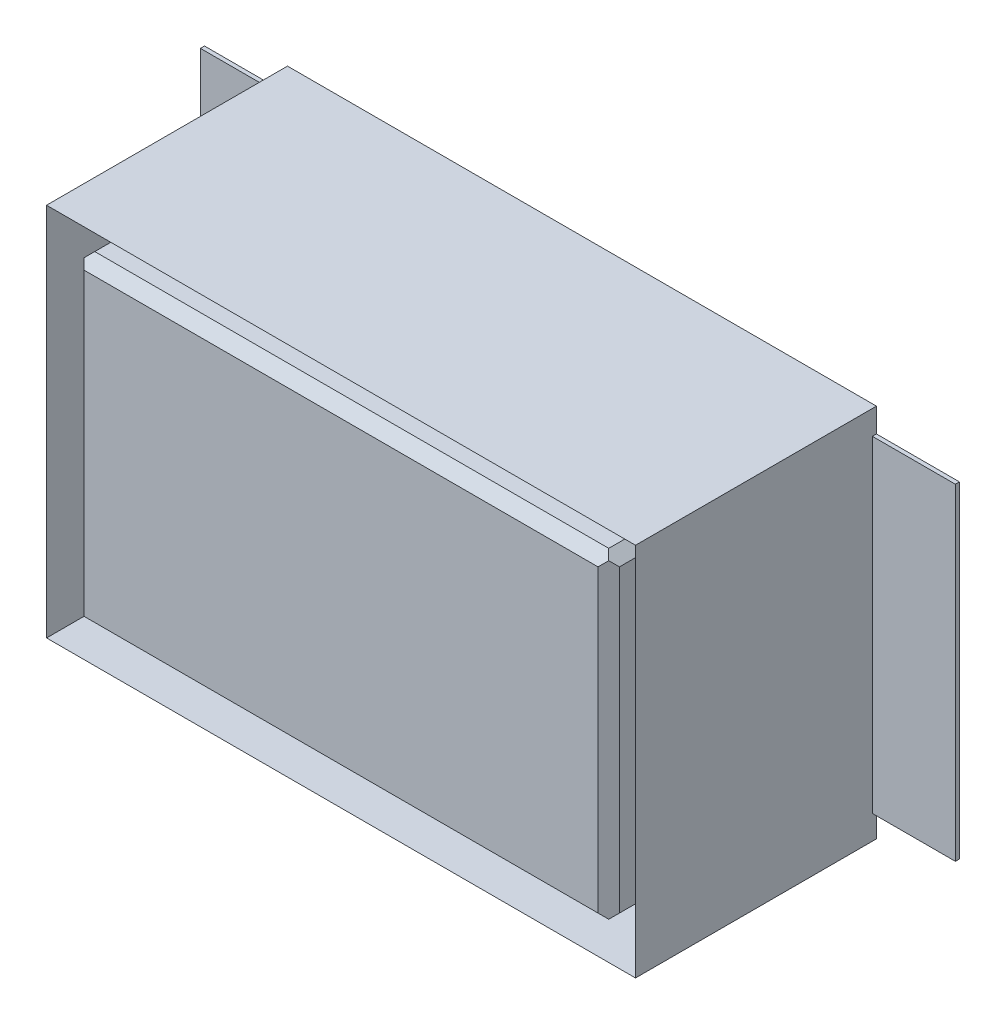
ISO-10303-21;
HEADER;
FILE_DESCRIPTION(('STEP AP214'),'2;1');
FILE_NAME('part.step','',(''),(''),'','','');
FILE_SCHEMA(('AUTOMOTIVE_DESIGN { 1 0 10303 214 1 1 1 1 }'));
ENDSEC;
DATA;
#1=APPLICATION_CONTEXT('core data for automotive mechanical design processes');
#2=APPLICATION_PROTOCOL_DEFINITION('international standard','automotive_design',2000,#1);
#3=PRODUCT_CONTEXT('',#1,'mechanical');
#4=PRODUCT('Part','Part','',(#3));
#5=PRODUCT_RELATED_PRODUCT_CATEGORY('part','',(#4));
#6=PRODUCT_DEFINITION_FORMATION('','',#4);
#7=PRODUCT_DEFINITION_CONTEXT('part definition',#1,'design');
#8=PRODUCT_DEFINITION('design','',#6,#7);
#9=PRODUCT_DEFINITION_SHAPE('','',#8);
#10=(LENGTH_UNIT() NAMED_UNIT(*) SI_UNIT(.MILLI.,.METRE.));
#11=(NAMED_UNIT(*) PLANE_ANGLE_UNIT() SI_UNIT($,.RADIAN.));
#12=(NAMED_UNIT(*) SI_UNIT($,.STERADIAN.) SOLID_ANGLE_UNIT());
#13=UNCERTAINTY_MEASURE_WITH_UNIT(LENGTH_MEASURE(1.E-05),#10,'distance_accuracy_value','');
#14=(GEOMETRIC_REPRESENTATION_CONTEXT(3) GLOBAL_UNCERTAINTY_ASSIGNED_CONTEXT((#13)) GLOBAL_UNIT_ASSIGNED_CONTEXT((#10,
#11,#12)) REPRESENTATION_CONTEXT('',''));
#15=CARTESIAN_POINT('',(0.,0.,0.));
#16=DIRECTION('',(0.,0.,1.));
#17=DIRECTION('',(1.,0.,0.));
#18=AXIS2_PLACEMENT_3D('',#15,#16,#17);
#19=CARTESIAN_POINT('',(-0.49,0.,0.5162));
#20=DIRECTION('',(-0.707106781186548,0.,0.707106781186548));
#21=DIRECTION('',(0.,1.,0.));
#22=AXIS2_PLACEMENT_3D('',#19,#20,#21);
#23=PLANE('',#22);
#24=DIRECTION('',(-0.577350269189626,0.577350269189626,-0.577350269189626));
#25=VECTOR('',#24,1.);
#26=CARTESIAN_POINT('',(-0.49,-0.29,0.5162));
#27=LINE('',#26,#25);
#28=CARTESIAN_POINT('',(-0.49,-0.29,0.5162));
#29=VERTEX_POINT('',#28);
#30=CARTESIAN_POINT('',(-0.5,-0.28,0.5062));
#31=VERTEX_POINT('',#30);
#32=EDGE_CURVE('P0_E199',#29,#31,#27,.T.);
#33=ORIENTED_EDGE('',*,*,#32,.F.);
#34=DIRECTION('',(-0.577350269189626,-0.577350269189626,-0.577350269189626));
#35=VECTOR('',#34,1.);
#36=CARTESIAN_POINT('',(-0.48,-0.28,0.5262));
#37=LINE('',#36,#35);
#38=CARTESIAN_POINT('',(-0.48,-0.28,0.5262));
#39=VERTEX_POINT('',#38);
#40=EDGE_CURVE('P0_E11',#39,#29,#37,.T.);
#41=ORIENTED_EDGE('',*,*,#40,.F.);
#42=DIRECTION('',(0.,-1.,0.));
#43=VECTOR('',#42,1.);
#44=CARTESIAN_POINT('',(-0.48,0.28,0.5262));
#45=LINE('',#44,#43);
#46=CARTESIAN_POINT('',(-0.48,0.28,0.5262));
#47=VERTEX_POINT('',#46);
#48=EDGE_CURVE('P0_E256',#47,#39,#45,.T.);
#49=ORIENTED_EDGE('',*,*,#48,.F.);
#50=DIRECTION('',(0.577350269189626,-0.577350269189626,0.577350269189626));
#51=VECTOR('',#50,1.);
#52=CARTESIAN_POINT('',(-0.49,0.29,0.5162));
#53=LINE('',#52,#51);
#54=CARTESIAN_POINT('',(-0.49,0.29,0.5162));
#55=VERTEX_POINT('',#54);
#56=EDGE_CURVE('P0_E257',#55,#47,#53,.T.);
#57=ORIENTED_EDGE('',*,*,#56,.F.);
#58=DIRECTION('',(0.577350269189626,0.577350269189626,0.577350269189626));
#59=VECTOR('',#58,1.);
#60=CARTESIAN_POINT('',(-0.5,0.28,0.5062));
#61=LINE('',#60,#59);
#62=CARTESIAN_POINT('',(-0.5,0.28,0.5062));
#63=VERTEX_POINT('',#62);
#64=EDGE_CURVE('P0_E317',#63,#55,#61,.T.);
#65=ORIENTED_EDGE('',*,*,#64,.F.);
#66=DIRECTION('',(0.,-1.,0.));
#67=VECTOR('',#66,1.);
#68=CARTESIAN_POINT('',(-0.5,0.28,0.5062));
#69=LINE('',#68,#67);
#70=EDGE_CURVE('P0_E389',#63,#31,#69,.T.);
#71=ORIENTED_EDGE('',*,*,#70,.T.);
#72=EDGE_LOOP('',(#33,#41,#49,#57,#65,#71));
#73=FACE_BOUND('',#72,.T.);
#74=ADVANCED_FACE('P0_F18',(#73),#23,.T.);
#75=CARTESIAN_POINT('',(0.,-0.29,0.5162));
#76=DIRECTION('',(0.,-0.707106781186548,0.707106781186548));
#77=DIRECTION('',(-1.,0.,0.));
#78=AXIS2_PLACEMENT_3D('',#75,#76,#77);
#79=PLANE('',#78);
#80=DIRECTION('',(-0.577350269189626,-0.577350269189626,-0.577350269189626));
#81=VECTOR('',#80,1.);
#82=CARTESIAN_POINT('',(0.49,-0.29,0.5162));
#83=LINE('',#82,#81);
#84=CARTESIAN_POINT('',(0.49,-0.29,0.5162));
#85=VERTEX_POINT('',#84);
#86=CARTESIAN_POINT('',(0.48,-0.3,0.5062));
#87=VERTEX_POINT('',#86);
#88=EDGE_CURVE('P0_E221',#85,#87,#83,.T.);
#89=ORIENTED_EDGE('',*,*,#88,.F.);
#90=DIRECTION('',(0.577350269189626,-0.577350269189626,-0.577350269189626));
#91=VECTOR('',#90,1.);
#92=CARTESIAN_POINT('',(0.48,-0.28,0.5262));
#93=LINE('',#92,#91);
#94=CARTESIAN_POINT('',(0.48,-0.28,0.5262));
#95=VERTEX_POINT('',#94);
#96=EDGE_CURVE('P0_E29',#95,#85,#93,.T.);
#97=ORIENTED_EDGE('',*,*,#96,.F.);
#98=DIRECTION('',(1.,0.,0.));
#99=VECTOR('',#98,1.);
#100=CARTESIAN_POINT('',(-0.48,-0.28,0.5262));
#101=LINE('',#100,#99);
#102=EDGE_CURVE('P0_E264',#39,#95,#101,.T.);
#103=ORIENTED_EDGE('',*,*,#102,.F.);
#104=ORIENTED_EDGE('',*,*,#40,.T.);
#105=DIRECTION('',(-0.577350269189626,0.577350269189626,0.577350269189626));
#106=VECTOR('',#105,1.);
#107=CARTESIAN_POINT('',(-0.48,-0.3,0.5062));
#108=LINE('',#107,#106);
#109=CARTESIAN_POINT('',(-0.48,-0.3,0.5062));
#110=VERTEX_POINT('',#109);
#111=EDGE_CURVE('P0_E191',#110,#29,#108,.T.);
#112=ORIENTED_EDGE('',*,*,#111,.F.);
#113=DIRECTION('',(1.,0.,0.));
#114=VECTOR('',#113,1.);
#115=CARTESIAN_POINT('',(-0.48,-0.3,0.5062));
#116=LINE('',#115,#114);
#117=EDGE_CURVE('P0_E194',#110,#87,#116,.T.);
#118=ORIENTED_EDGE('',*,*,#117,.T.);
#119=EDGE_LOOP('',(#89,#97,#103,#104,#112,#118));
#120=FACE_BOUND('',#119,.T.);
#121=ADVANCED_FACE('P0_F20',(#120),#79,.T.);
#122=CARTESIAN_POINT('',(0.49,0.,0.5162));
#123=DIRECTION('',(0.707106781186548,0.,0.707106781186548));
#124=DIRECTION('',(0.,-1.,0.));
#125=AXIS2_PLACEMENT_3D('',#122,#123,#124);
#126=PLANE('',#125);
#127=DIRECTION('',(0.577350269189626,-0.577350269189626,-0.577350269189626));
#128=VECTOR('',#127,1.);
#129=CARTESIAN_POINT('',(0.49,0.29,0.5162));
#130=LINE('',#129,#128);
#131=CARTESIAN_POINT('',(0.49,0.29,0.5162));
#132=VERTEX_POINT('',#131);
#133=CARTESIAN_POINT('',(0.5,0.28,0.5062));
#134=VERTEX_POINT('',#133);
#135=EDGE_CURVE('P0_E298',#132,#134,#130,.T.);
#136=ORIENTED_EDGE('',*,*,#135,.F.);
#137=DIRECTION('',(0.577350269189626,0.577350269189626,-0.577350269189626));
#138=VECTOR('',#137,1.);
#139=CARTESIAN_POINT('',(0.48,0.28,0.5262));
#140=LINE('',#139,#138);
#141=CARTESIAN_POINT('',(0.48,0.28,0.5262));
#142=VERTEX_POINT('',#141);
#143=EDGE_CURVE('P0_E354',#142,#132,#140,.T.);
#144=ORIENTED_EDGE('',*,*,#143,.F.);
#145=DIRECTION('',(0.,1.,0.));
#146=VECTOR('',#145,1.);
#147=CARTESIAN_POINT('',(0.48,-0.28,0.5262));
#148=LINE('',#147,#146);
#149=EDGE_CURVE('P0_E268',#95,#142,#148,.T.);
#150=ORIENTED_EDGE('',*,*,#149,.F.);
#151=ORIENTED_EDGE('',*,*,#96,.T.);
#152=DIRECTION('',(-0.577350269189626,-0.577350269189626,0.577350269189626));
#153=VECTOR('',#152,1.);
#154=CARTESIAN_POINT('',(0.5,-0.28,0.5062));
#155=LINE('',#154,#153);
#156=CARTESIAN_POINT('',(0.5,-0.28,0.5062));
#157=VERTEX_POINT('',#156);
#158=EDGE_CURVE('P0_E347',#157,#85,#155,.T.);
#159=ORIENTED_EDGE('',*,*,#158,.F.);
#160=DIRECTION('',(0.,1.,0.));
#161=VECTOR('',#160,1.);
#162=CARTESIAN_POINT('',(0.5,-0.28,0.5062));
#163=LINE('',#162,#161);
#164=EDGE_CURVE('P0_E334',#157,#134,#163,.T.);
#165=ORIENTED_EDGE('',*,*,#164,.T.);
#166=EDGE_LOOP('',(#136,#144,#150,#151,#159,#165));
#167=FACE_BOUND('',#166,.T.);
#168=ADVANCED_FACE('P0_F370',(#167),#126,.T.);
#169=CARTESIAN_POINT('',(0.,0.,0.5262));
#170=DIRECTION('',(0.,0.,1.));
#171=DIRECTION('',(1.,0.,0.));
#172=AXIS2_PLACEMENT_3D('',#169,#170,#171);
#173=PLANE('',#172);
#174=DIRECTION('',(-1.,0.,0.));
#175=VECTOR('',#174,1.);
#176=CARTESIAN_POINT('',(0.48,0.28,0.5262));
#177=LINE('',#176,#175);
#178=EDGE_CURVE('P0_E252',#142,#47,#177,.T.);
#179=ORIENTED_EDGE('',*,*,#178,.T.);
#180=ORIENTED_EDGE('',*,*,#48,.T.);
#181=ORIENTED_EDGE('',*,*,#102,.T.);
#182=ORIENTED_EDGE('',*,*,#149,.T.);
#183=EDGE_LOOP('',(#179,#180,#181,#182));
#184=FACE_BOUND('',#183,.T.);
#185=ADVANCED_FACE('P0_F500',(#184),#173,.T.);
#186=CARTESIAN_POINT('',(0.,0.29,0.5162));
#187=DIRECTION('',(0.,0.707106781186548,0.707106781186548));
#188=DIRECTION('',(1.,0.,0.));
#189=AXIS2_PLACEMENT_3D('',#186,#187,#188);
#190=PLANE('',#189);
#191=ORIENTED_EDGE('',*,*,#143,.T.);
#192=DIRECTION('',(0.577350269189626,-0.577350269189626,0.577350269189626));
#193=VECTOR('',#192,1.);
#194=CARTESIAN_POINT('',(0.48,0.3,0.5062));
#195=LINE('',#194,#193);
#196=CARTESIAN_POINT('',(0.48,0.3,0.5062));
#197=VERTEX_POINT('',#196);
#198=EDGE_CURVE('P0_E303',#197,#132,#195,.T.);
#199=ORIENTED_EDGE('',*,*,#198,.F.);
#200=DIRECTION('',(-1.,0.,0.));
#201=VECTOR('',#200,1.);
#202=CARTESIAN_POINT('',(0.48,0.3,0.5062));
#203=LINE('',#202,#201);
#204=CARTESIAN_POINT('',(-0.48,0.3,0.5062));
#205=VERTEX_POINT('',#204);
#206=EDGE_CURVE('P0_E426',#197,#205,#203,.T.);
#207=ORIENTED_EDGE('',*,*,#206,.T.);
#208=DIRECTION('',(-0.577350269189626,-0.577350269189626,0.577350269189626));
#209=VECTOR('',#208,1.);
#210=CARTESIAN_POINT('',(-0.48,0.3,0.5062));
#211=LINE('',#210,#209);
#212=EDGE_CURVE('P0_E321',#205,#55,#211,.T.);
#213=ORIENTED_EDGE('',*,*,#212,.T.);
#214=ORIENTED_EDGE('',*,*,#56,.T.);
#215=ORIENTED_EDGE('',*,*,#178,.F.);
#216=EDGE_LOOP('',(#191,#199,#207,#213,#214,#215));
#217=FACE_BOUND('',#216,.T.);
#218=ADVANCED_FACE('P0_F502',(#217),#190,.T.);
#219=CARTESIAN_POINT('',(0.5,0.3,0.0762));
#220=DIRECTION('',(0.,1.,0.));
#221=DIRECTION('',(1.,0.,0.));
#222=AXIS2_PLACEMENT_3D('',#219,#220,#221);
#223=PLANE('',#222);
#224=DIRECTION('',(-1.,0.,0.));
#225=VECTOR('',#224,1.);
#226=CARTESIAN_POINT('',(0.48,0.3,0.1262));
#227=LINE('',#226,#225);
#228=CARTESIAN_POINT('',(0.48,0.3,0.1262));
#229=VERTEX_POINT('',#228);
#230=CARTESIAN_POINT('',(-0.48,0.3,0.1262));
#231=VERTEX_POINT('',#230);
#232=EDGE_CURVE('P0_E316',#229,#231,#227,.T.);
#233=ORIENTED_EDGE('',*,*,#232,.T.);
#234=DIRECTION('',(0.,0.,-1.));
#235=VECTOR('',#234,1.);
#236=CARTESIAN_POINT('',(-0.48,0.3,0.5062));
#237=LINE('',#236,#235);
#238=EDGE_CURVE('P0_E423',#205,#231,#237,.T.);
#239=ORIENTED_EDGE('',*,*,#238,.F.);
#240=ORIENTED_EDGE('',*,*,#206,.F.);
#241=DIRECTION('',(0.,0.,-1.));
#242=VECTOR('',#241,1.);
#243=CARTESIAN_POINT('',(0.48,0.3,0.5062));
#244=LINE('',#243,#242);
#245=EDGE_CURVE('P0_E288',#197,#229,#244,.T.);
#246=ORIENTED_EDGE('',*,*,#245,.T.);
#247=EDGE_LOOP('',(#233,#239,#240,#246));
#248=FACE_BOUND('',#247,.T.);
#249=ADVANCED_FACE('P0_F509',(#248),#223,.T.);
#250=CARTESIAN_POINT('',(-0.49,0.29,0.3262));
#251=DIRECTION('',(-0.707106781186548,0.707106781186548,0.));
#252=DIRECTION('',(0.,0.,1.));
#253=AXIS2_PLACEMENT_3D('',#250,#251,#252);
#254=PLANE('',#253);
#255=DIRECTION('',(0.,0.,-1.));
#256=VECTOR('',#255,1.);
#257=CARTESIAN_POINT('',(-0.5,0.28,0.5062));
#258=LINE('',#257,#256);
#259=CARTESIAN_POINT('',(-0.5,0.28,0.1262));
#260=VERTEX_POINT('',#259);
#261=EDGE_CURVE('P0_E22',#63,#260,#258,.T.);
#262=ORIENTED_EDGE('',*,*,#261,.F.);
#263=ORIENTED_EDGE('',*,*,#64,.T.);
#264=ORIENTED_EDGE('',*,*,#212,.F.);
#265=ORIENTED_EDGE('',*,*,#238,.T.);
#266=DIRECTION('',(0.707106781186548,0.707106781186548,0.));
#267=VECTOR('',#266,1.);
#268=CARTESIAN_POINT('',(-0.5,0.28,0.1262));
#269=LINE('',#268,#267);
#270=EDGE_CURVE('P0_E312',#260,#231,#269,.T.);
#271=ORIENTED_EDGE('',*,*,#270,.F.);
#272=EDGE_LOOP('',(#262,#263,#264,#265,#271));
#273=FACE_BOUND('',#272,.T.);
#274=ADVANCED_FACE('P0_F515',(#273),#254,.T.);
#275=CARTESIAN_POINT('',(-0.5,0.3,0.0762));
#276=DIRECTION('',(-1.,0.,0.));
#277=DIRECTION('',(0.,0.,1.));
#278=AXIS2_PLACEMENT_3D('',#275,#276,#277);
#279=PLANE('',#278);
#280=ORIENTED_EDGE('',*,*,#70,.F.);
#281=ORIENTED_EDGE('',*,*,#261,.T.);
#282=DIRECTION('',(0.,-1.,0.));
#283=VECTOR('',#282,1.);
#284=CARTESIAN_POINT('',(-0.5,0.28,0.1262));
#285=LINE('',#284,#283);
#286=CARTESIAN_POINT('',(-0.5,-0.28,0.1262));
#287=VERTEX_POINT('',#286);
#288=EDGE_CURVE('P0_E244',#260,#287,#285,.T.);
#289=ORIENTED_EDGE('',*,*,#288,.T.);
#290=DIRECTION('',(0.,0.,-1.));
#291=VECTOR('',#290,1.);
#292=CARTESIAN_POINT('',(-0.5,-0.28,0.5062));
#293=LINE('',#292,#291);
#294=EDGE_CURVE('P0_E357',#31,#287,#293,.T.);
#295=ORIENTED_EDGE('',*,*,#294,.F.);
#296=EDGE_LOOP('',(#280,#281,#289,#295));
#297=FACE_BOUND('',#296,.T.);
#298=ADVANCED_FACE('P0_F440',(#297),#279,.T.);
#299=CARTESIAN_POINT('',(-0.49,-0.29,0.3262));
#300=DIRECTION('',(-0.707106781186548,-0.707106781186548,0.));
#301=DIRECTION('',(-0.707106781186548,0.707106781186548,0.));
#302=AXIS2_PLACEMENT_3D('',#299,#300,#301);
#303=PLANE('',#302);
#304=DIRECTION('',(0.,0.,-1.));
#305=VECTOR('',#304,1.);
#306=CARTESIAN_POINT('',(-0.48,-0.3,0.5062));
#307=LINE('',#306,#305);
#308=CARTESIAN_POINT('',(-0.48,-0.3,0.1262));
#309=VERTEX_POINT('',#308);
#310=EDGE_CURVE('P0_E200',#110,#309,#307,.T.);
#311=ORIENTED_EDGE('',*,*,#310,.F.);
#312=ORIENTED_EDGE('',*,*,#111,.T.);
#313=ORIENTED_EDGE('',*,*,#32,.T.);
#314=ORIENTED_EDGE('',*,*,#294,.T.);
#315=DIRECTION('',(-0.707106781186548,0.707106781186548,0.));
#316=VECTOR('',#315,1.);
#317=CARTESIAN_POINT('',(-0.48,-0.3,0.1262));
#318=LINE('',#317,#316);
#319=EDGE_CURVE('P0_E204',#309,#287,#318,.T.);
#320=ORIENTED_EDGE('',*,*,#319,.F.);
#321=EDGE_LOOP('',(#311,#312,#313,#314,#320));
#322=FACE_BOUND('',#321,.T.);
#323=ADVANCED_FACE('P0_F202',(#322),#303,.T.);
#324=CARTESIAN_POINT('',(-0.5,-0.3,0.0762));
#325=DIRECTION('',(0.,-1.,0.));
#326=DIRECTION('',(0.,0.,-1.));
#327=AXIS2_PLACEMENT_3D('',#324,#325,#326);
#328=PLANE('',#327);
#329=ORIENTED_EDGE('',*,*,#117,.F.);
#330=ORIENTED_EDGE('',*,*,#310,.T.);
#331=DIRECTION('',(1.,0.,0.));
#332=VECTOR('',#331,1.);
#333=CARTESIAN_POINT('',(-0.48,-0.3,0.1262));
#334=LINE('',#333,#332);
#335=CARTESIAN_POINT('',(0.48,-0.3,0.1262));
#336=VERTEX_POINT('',#335);
#337=EDGE_CURVE('P0_E245',#309,#336,#334,.T.);
#338=ORIENTED_EDGE('',*,*,#337,.T.);
#339=DIRECTION('',(0.,0.,-1.));
#340=VECTOR('',#339,1.);
#341=CARTESIAN_POINT('',(0.48,-0.3,0.5062));
#342=LINE('',#341,#340);
#343=EDGE_CURVE('P0_E211',#87,#336,#342,.T.);
#344=ORIENTED_EDGE('',*,*,#343,.F.);
#345=EDGE_LOOP('',(#329,#330,#338,#344));
#346=FACE_BOUND('',#345,.T.);
#347=ADVANCED_FACE('P0_F210',(#346),#328,.T.);
#348=CARTESIAN_POINT('',(0.49,-0.29,0.3262));
#349=DIRECTION('',(0.707106781186548,-0.707106781186548,0.));
#350=DIRECTION('',(0.,0.,-1.));
#351=AXIS2_PLACEMENT_3D('',#348,#349,#350);
#352=PLANE('',#351);
#353=DIRECTION('',(0.,0.,-1.));
#354=VECTOR('',#353,1.);
#355=CARTESIAN_POINT('',(0.5,-0.28,0.5062));
#356=LINE('',#355,#354);
#357=CARTESIAN_POINT('',(0.5,-0.28,0.1262));
#358=VERTEX_POINT('',#357);
#359=EDGE_CURVE('P0_E361',#157,#358,#356,.T.);
#360=ORIENTED_EDGE('',*,*,#359,.F.);
#361=ORIENTED_EDGE('',*,*,#158,.T.);
#362=ORIENTED_EDGE('',*,*,#88,.T.);
#363=ORIENTED_EDGE('',*,*,#343,.T.);
#364=DIRECTION('',(-0.707106781186548,-0.707106781186548,0.));
#365=VECTOR('',#364,1.);
#366=CARTESIAN_POINT('',(0.5,-0.28,0.1262));
#367=LINE('',#366,#365);
#368=EDGE_CURVE('P0_E325',#358,#336,#367,.T.);
#369=ORIENTED_EDGE('',*,*,#368,.F.);
#370=EDGE_LOOP('',(#360,#361,#362,#363,#369));
#371=FACE_BOUND('',#370,.T.);
#372=ADVANCED_FACE('P0_F375',(#371),#352,.T.);
#373=CARTESIAN_POINT('',(0.5,-0.3,0.0762));
#374=DIRECTION('',(1.,0.,0.));
#375=DIRECTION('',(0.,1.,0.));
#376=AXIS2_PLACEMENT_3D('',#373,#374,#375);
#377=PLANE('',#376);
#378=ORIENTED_EDGE('',*,*,#164,.F.);
#379=ORIENTED_EDGE('',*,*,#359,.T.);
#380=DIRECTION('',(0.,1.,0.));
#381=VECTOR('',#380,1.);
#382=CARTESIAN_POINT('',(0.5,-0.28,0.1262));
#383=LINE('',#382,#381);
#384=CARTESIAN_POINT('',(0.5,0.28,0.1262));
#385=VERTEX_POINT('',#384);
#386=EDGE_CURVE('P0_E240',#358,#385,#383,.T.);
#387=ORIENTED_EDGE('',*,*,#386,.T.);
#388=DIRECTION('',(0.,0.,-1.));
#389=VECTOR('',#388,1.);
#390=CARTESIAN_POINT('',(0.5,0.28,0.5062));
#391=LINE('',#390,#389);
#392=EDGE_CURVE('P0_E302',#134,#385,#391,.T.);
#393=ORIENTED_EDGE('',*,*,#392,.F.);
#394=EDGE_LOOP('',(#378,#379,#387,#393));
#395=FACE_BOUND('',#394,.T.);
#396=ADVANCED_FACE('P0_F496',(#395),#377,.T.);
#397=CARTESIAN_POINT('',(0.49,0.29,0.3262));
#398=DIRECTION('',(0.707106781186548,0.707106781186548,0.));
#399=DIRECTION('',(0.,0.,-1.));
#400=AXIS2_PLACEMENT_3D('',#397,#398,#399);
#401=PLANE('',#400);
#402=ORIENTED_EDGE('',*,*,#245,.F.);
#403=ORIENTED_EDGE('',*,*,#198,.T.);
#404=ORIENTED_EDGE('',*,*,#135,.T.);
#405=ORIENTED_EDGE('',*,*,#392,.T.);
#406=DIRECTION('',(0.707106781186548,-0.707106781186548,0.));
#407=VECTOR('',#406,1.);
#408=CARTESIAN_POINT('',(0.48,0.3,0.1262));
#409=LINE('',#408,#407);
#410=EDGE_CURVE('P0_E331',#229,#385,#409,.T.);
#411=ORIENTED_EDGE('',*,*,#410,.F.);
#412=EDGE_LOOP('',(#402,#403,#404,#405,#411));
#413=FACE_BOUND('',#412,.T.);
#414=ADVANCED_FACE('P0_F498',(#413),#401,.T.);
#415=CARTESIAN_POINT('',(-0.4659973957868,-0.25,0.1262));
#416=DIRECTION('',(-1.,0.,0.));
#417=DIRECTION('',(0.,0.,1.));
#418=AXIS2_PLACEMENT_3D('',#415,#416,#417);
#419=PLANE('',#418);
#420=DIRECTION('',(0.,0.,-1.));
#421=VECTOR('',#420,1.);
#422=CARTESIAN_POINT('',(-0.4659973957868,0.2,0.1262));
#423=LINE('',#422,#421);
#424=CARTESIAN_POINT('',(-0.4659973957868,0.2,0.1262));
#425=VERTEX_POINT('',#424);
#426=CARTESIAN_POINT('',(-0.4659973957868,0.2,0.0862));
#427=VERTEX_POINT('',#426);
#428=EDGE_CURVE('P0_E284',#425,#427,#423,.T.);
#429=ORIENTED_EDGE('',*,*,#428,.T.);
#430=DIRECTION('',(0.,1.,0.));
#431=VECTOR('',#430,1.);
#432=CARTESIAN_POINT('',(-0.4659973957868,-0.25,0.0862));
#433=LINE('',#432,#431);
#434=CARTESIAN_POINT('',(-0.4659973957868,-0.25,0.0862));
#435=VERTEX_POINT('',#434);
#436=EDGE_CURVE('P0_E277',#435,#427,#433,.T.);
#437=ORIENTED_EDGE('',*,*,#436,.F.);
#438=DIRECTION('',(0.,0.,-1.));
#439=VECTOR('',#438,1.);
#440=CARTESIAN_POINT('',(-0.4659973957868,-0.25,0.1262));
#441=LINE('',#440,#439);
#442=CARTESIAN_POINT('',(-0.4659973957868,-0.25,0.1262));
#443=VERTEX_POINT('',#442);
#444=EDGE_CURVE('P0_E311',#443,#435,#441,.T.);
#445=ORIENTED_EDGE('',*,*,#444,.F.);
#446=DIRECTION('',(0.,1.,0.));
#447=VECTOR('',#446,1.);
#448=CARTESIAN_POINT('',(-0.4659973957868,-0.25,0.1262));
#449=LINE('',#448,#447);
#450=EDGE_CURVE('P0_E258',#443,#425,#449,.T.);
#451=ORIENTED_EDGE('',*,*,#450,.T.);
#452=EDGE_LOOP('',(#429,#437,#445,#451));
#453=FACE_BOUND('',#452,.T.);
#454=ADVANCED_FACE('P0_F1065',(#453),#419,.T.);
#455=CARTESIAN_POINT('',(-0.4659973957868,0.25,0.1262));
#456=DIRECTION('',(0.,0.,-1.));
#457=DIRECTION('',(-1.,0.,0.));
#458=AXIS2_PLACEMENT_3D('',#455,#456,#457);
#459=CYLINDRICAL_SURFACE('',#458,0.05);
#460=DIRECTION('',(0.,0.,-1.));
#461=VECTOR('',#460,1.);
#462=CARTESIAN_POINT('',(-0.4159973957868,0.25,0.1262));
#463=LINE('',#462,#461);
#464=CARTESIAN_POINT('',(-0.4159973957868,0.25,0.1262));
#465=VERTEX_POINT('',#464);
#466=CARTESIAN_POINT('',(-0.4159973957868,0.25,0.0862));
#467=VERTEX_POINT('',#466);
#468=EDGE_CURVE('P0_E233',#465,#467,#463,.T.);
#469=ORIENTED_EDGE('',*,*,#468,.T.);
#470=CARTESIAN_POINT('',(-0.4659973957868,0.25,0.0862));
#471=DIRECTION('',(0.,0.,1.));
#472=DIRECTION('',(0.,-1.,0.));
#473=AXIS2_PLACEMENT_3D('',#470,#471,#472);
#474=CIRCLE('',#473,0.05);
#475=EDGE_CURVE('P0_E279',#427,#467,#474,.T.);
#476=ORIENTED_EDGE('',*,*,#475,.F.);
#477=ORIENTED_EDGE('',*,*,#428,.F.);
#478=CARTESIAN_POINT('',(-0.4659973957868,0.25,0.1262));
#479=DIRECTION('',(0.,0.,-1.));
#480=DIRECTION('',(1.,0.,0.));
#481=AXIS2_PLACEMENT_3D('',#478,#479,#480);
#482=CIRCLE('',#481,0.05);
#483=EDGE_CURVE('P0_E263',#465,#425,#482,.T.);
#484=ORIENTED_EDGE('',*,*,#483,.F.);
#485=EDGE_LOOP('',(#469,#476,#477,#484));
#486=FACE_BOUND('',#485,.T.);
#487=ADVANCED_FACE('P0_F1077',(#486),#459,.F.);
#488=CARTESIAN_POINT('',(-0.4159973957868,0.25,0.1262));
#489=DIRECTION('',(0.,1.,0.));
#490=DIRECTION('',(1.,0.,0.));
#491=AXIS2_PLACEMENT_3D('',#488,#489,#490);
#492=PLANE('',#491);
#493=DIRECTION('',(0.,0.,-1.));
#494=VECTOR('',#493,1.);
#495=CARTESIAN_POINT('',(-0.2159973957868,0.25,0.1262));
#496=LINE('',#495,#494);
#497=CARTESIAN_POINT('',(-0.2159973957868,0.25,0.1262));
#498=VERTEX_POINT('',#497);
#499=CARTESIAN_POINT('',(-0.2159973957868,0.25,0.0862));
#500=VERTEX_POINT('',#499);
#501=EDGE_CURVE('P0_E231',#498,#500,#496,.T.);
#502=ORIENTED_EDGE('',*,*,#501,.T.);
#503=DIRECTION('',(1.,0.,0.));
#504=VECTOR('',#503,1.);
#505=CARTESIAN_POINT('',(-0.4159973957868,0.25,0.0862));
#506=LINE('',#505,#504);
#507=EDGE_CURVE('P0_E283',#467,#500,#506,.T.);
#508=ORIENTED_EDGE('',*,*,#507,.F.);
#509=ORIENTED_EDGE('',*,*,#468,.F.);
#510=DIRECTION('',(1.,0.,0.));
#511=VECTOR('',#510,1.);
#512=CARTESIAN_POINT('',(-0.4159973957868,0.25,0.1262));
#513=LINE('',#512,#511);
#514=EDGE_CURVE('P0_E306',#465,#498,#513,.T.);
#515=ORIENTED_EDGE('',*,*,#514,.T.);
#516=EDGE_LOOP('',(#502,#508,#509,#515));
#517=FACE_BOUND('',#516,.T.);
#518=ADVANCED_FACE('P0_F1089',(#517),#492,.T.);
#519=CARTESIAN_POINT('',(-0.2159973957868,0.25,0.1262));
#520=DIRECTION('',(1.,0.,0.));
#521=DIRECTION('',(0.,1.,0.));
#522=AXIS2_PLACEMENT_3D('',#519,#520,#521);
#523=PLANE('',#522);
#524=DIRECTION('',(0.,0.,-1.));
#525=VECTOR('',#524,1.);
#526=CARTESIAN_POINT('',(-0.2159973957868,-0.25,0.1262));
#527=LINE('',#526,#525);
#528=CARTESIAN_POINT('',(-0.2159973957868,-0.25,0.1262));
#529=VERTEX_POINT('',#528);
#530=CARTESIAN_POINT('',(-0.2159973957868,-0.25,0.0862));
#531=VERTEX_POINT('',#530);
#532=EDGE_CURVE('P0_E241',#529,#531,#527,.T.);
#533=ORIENTED_EDGE('',*,*,#532,.T.);
#534=DIRECTION('',(0.,-1.,0.));
#535=VECTOR('',#534,1.);
#536=CARTESIAN_POINT('',(-0.2159973957868,0.25,0.0862));
#537=LINE('',#536,#535);
#538=EDGE_CURVE('P0_E234',#500,#531,#537,.T.);
#539=ORIENTED_EDGE('',*,*,#538,.F.);
#540=ORIENTED_EDGE('',*,*,#501,.F.);
#541=DIRECTION('',(0.,-1.,0.));
#542=VECTOR('',#541,1.);
#543=CARTESIAN_POINT('',(-0.2159973957868,0.25,0.1262));
#544=LINE('',#543,#542);
#545=EDGE_CURVE('P0_E262',#498,#529,#544,.T.);
#546=ORIENTED_EDGE('',*,*,#545,.T.);
#547=EDGE_LOOP('',(#533,#539,#540,#546));
#548=FACE_BOUND('',#547,.T.);
#549=ADVANCED_FACE('P0_F1099',(#548),#523,.T.);
#550=CARTESIAN_POINT('',(0.,0.,0.0862));
#551=DIRECTION('',(0.,0.,-1.));
#552=DIRECTION('',(0.,-1.,0.));
#553=AXIS2_PLACEMENT_3D('',#550,#551,#552);
#554=PLANE('',#553);
#555=DIRECTION('',(-1.,0.,0.));
#556=VECTOR('',#555,1.);
#557=CARTESIAN_POINT('',(-0.2159973957868,-0.25,0.0862));
#558=LINE('',#557,#556);
#559=EDGE_CURVE('P0_E297',#531,#435,#558,.T.);
#560=ORIENTED_EDGE('',*,*,#559,.T.);
#561=ORIENTED_EDGE('',*,*,#436,.T.);
#562=ORIENTED_EDGE('',*,*,#475,.T.);
#563=ORIENTED_EDGE('',*,*,#507,.T.);
#564=ORIENTED_EDGE('',*,*,#538,.T.);
#565=EDGE_LOOP('',(#560,#561,#562,#563,#564));
#566=FACE_BOUND('',#565,.T.);
#567=ADVANCED_FACE('P0_F1110',(#566),#554,.T.);
#568=CARTESIAN_POINT('',(0.,0.,0.0862));
#569=DIRECTION('',(0.,0.,-1.));
#570=DIRECTION('',(0.,-1.,0.));
#571=AXIS2_PLACEMENT_3D('',#568,#569,#570);
#572=PLANE('',#571);
#573=DIRECTION('',(-1.,0.,0.));
#574=VECTOR('',#573,1.);
#575=CARTESIAN_POINT('',(0.4340026042132,-0.25,0.0862));
#576=LINE('',#575,#574);
#577=CARTESIAN_POINT('',(0.4340026042132,-0.25,0.0862));
#578=VERTEX_POINT('',#577);
#579=CARTESIAN_POINT('',(0.1840026042132,-0.25,0.0862));
#580=VERTEX_POINT('',#579);
#581=EDGE_CURVE('P0_E274',#578,#580,#576,.T.);
#582=ORIENTED_EDGE('',*,*,#581,.T.);
#583=DIRECTION('',(0.,1.,0.));
#584=VECTOR('',#583,1.);
#585=CARTESIAN_POINT('',(0.1840026042132,-0.25,0.0862));
#586=LINE('',#585,#584);
#587=CARTESIAN_POINT('',(0.1840026042132,0.25,0.0862));
#588=VERTEX_POINT('',#587);
#589=EDGE_CURVE('P0_E230',#580,#588,#586,.T.);
#590=ORIENTED_EDGE('',*,*,#589,.T.);
#591=DIRECTION('',(1.,0.,0.));
#592=VECTOR('',#591,1.);
#593=CARTESIAN_POINT('',(0.1840026042132,0.25,0.0862));
#594=LINE('',#593,#592);
#595=CARTESIAN_POINT('',(0.4340026042132,0.25,0.0862));
#596=VERTEX_POINT('',#595);
#597=EDGE_CURVE('P0_E225',#588,#596,#594,.T.);
#598=ORIENTED_EDGE('',*,*,#597,.T.);
#599=DIRECTION('',(0.,-1.,0.));
#600=VECTOR('',#599,1.);
#601=CARTESIAN_POINT('',(0.4340026042132,0.25,0.0862));
#602=LINE('',#601,#600);
#603=EDGE_CURVE('P0_E273',#596,#578,#602,.T.);
#604=ORIENTED_EDGE('',*,*,#603,.T.);
#605=EDGE_LOOP('',(#582,#590,#598,#604));
#606=FACE_BOUND('',#605,.T.);
#607=ADVANCED_FACE('P0_F467',(#606),#572,.T.);
#608=CARTESIAN_POINT('',(0.4340026042132,-0.25,0.1262));
#609=DIRECTION('',(0.,-1.,0.));
#610=DIRECTION('',(0.,0.,-1.));
#611=AXIS2_PLACEMENT_3D('',#608,#609,#610);
#612=PLANE('',#611);
#613=DIRECTION('',(0.,0.,-1.));
#614=VECTOR('',#613,1.);
#615=CARTESIAN_POINT('',(0.1840026042132,-0.25,0.1262));
#616=LINE('',#615,#614);
#617=CARTESIAN_POINT('',(0.1840026042132,-0.25,0.1262));
#618=VERTEX_POINT('',#617);
#619=EDGE_CURVE('P0_E278',#618,#580,#616,.T.);
#620=ORIENTED_EDGE('',*,*,#619,.T.);
#621=ORIENTED_EDGE('',*,*,#581,.F.);
#622=DIRECTION('',(0.,0.,-1.));
#623=VECTOR('',#622,1.);
#624=CARTESIAN_POINT('',(0.4340026042132,-0.25,0.1262));
#625=LINE('',#624,#623);
#626=CARTESIAN_POINT('',(0.4340026042132,-0.25,0.1262));
#627=VERTEX_POINT('',#626);
#628=EDGE_CURVE('P0_E411',#627,#578,#625,.T.);
#629=ORIENTED_EDGE('',*,*,#628,.F.);
#630=DIRECTION('',(-1.,0.,0.));
#631=VECTOR('',#630,1.);
#632=CARTESIAN_POINT('',(0.4340026042132,-0.25,0.1262));
#633=LINE('',#632,#631);
#634=EDGE_CURVE('P0_E250',#627,#618,#633,.T.);
#635=ORIENTED_EDGE('',*,*,#634,.T.);
#636=EDGE_LOOP('',(#620,#621,#629,#635));
#637=FACE_BOUND('',#636,.T.);
#638=ADVANCED_FACE('P0_F464',(#637),#612,.T.);
#639=CARTESIAN_POINT('',(0.1840026042132,-0.25,0.1262));
#640=DIRECTION('',(-1.,0.,0.));
#641=DIRECTION('',(0.,0.,1.));
#642=AXIS2_PLACEMENT_3D('',#639,#640,#641);
#643=PLANE('',#642);
#644=DIRECTION('',(0.,0.,-1.));
#645=VECTOR('',#644,1.);
#646=CARTESIAN_POINT('',(0.1840026042132,0.25,0.1262));
#647=LINE('',#646,#645);
#648=CARTESIAN_POINT('',(0.1840026042132,0.25,0.1262));
#649=VERTEX_POINT('',#648);
#650=EDGE_CURVE('P0_E227',#649,#588,#647,.T.);
#651=ORIENTED_EDGE('',*,*,#650,.T.);
#652=ORIENTED_EDGE('',*,*,#589,.F.);
#653=ORIENTED_EDGE('',*,*,#619,.F.);
#654=DIRECTION('',(0.,1.,0.));
#655=VECTOR('',#654,1.);
#656=CARTESIAN_POINT('',(0.1840026042132,-0.25,0.1262));
#657=LINE('',#656,#655);
#658=EDGE_CURVE('P0_E246',#618,#649,#657,.T.);
#659=ORIENTED_EDGE('',*,*,#658,.T.);
#660=EDGE_LOOP('',(#651,#652,#653,#659));
#661=FACE_BOUND('',#660,.T.);
#662=ADVANCED_FACE('P0_F472',(#661),#643,.T.);
#663=CARTESIAN_POINT('',(0.1840026042132,0.25,0.1262));
#664=DIRECTION('',(0.,1.,0.));
#665=DIRECTION('',(1.,0.,0.));
#666=AXIS2_PLACEMENT_3D('',#663,#664,#665);
#667=PLANE('',#666);
#668=DIRECTION('',(0.,0.,-1.));
#669=VECTOR('',#668,1.);
#670=CARTESIAN_POINT('',(0.4340026042132,0.25,0.1262));
#671=LINE('',#670,#669);
#672=CARTESIAN_POINT('',(0.4340026042132,0.25,0.1262));
#673=VERTEX_POINT('',#672);
#674=EDGE_CURVE('P0_E269',#673,#596,#671,.T.);
#675=ORIENTED_EDGE('',*,*,#674,.T.);
#676=ORIENTED_EDGE('',*,*,#597,.F.);
#677=ORIENTED_EDGE('',*,*,#650,.F.);
#678=DIRECTION('',(1.,0.,0.));
#679=VECTOR('',#678,1.);
#680=CARTESIAN_POINT('',(0.1840026042132,0.25,0.1262));
#681=LINE('',#680,#679);
#682=EDGE_CURVE('P0_E251',#649,#673,#681,.T.);
#683=ORIENTED_EDGE('',*,*,#682,.T.);
#684=EDGE_LOOP('',(#675,#676,#677,#683));
#685=FACE_BOUND('',#684,.T.);
#686=ADVANCED_FACE('P0_F470',(#685),#667,.T.);
#687=CARTESIAN_POINT('',(0.4340026042132,0.25,0.1262));
#688=DIRECTION('',(1.,0.,0.));
#689=DIRECTION('',(0.,1.,0.));
#690=AXIS2_PLACEMENT_3D('',#687,#688,#689);
#691=PLANE('',#690);
#692=ORIENTED_EDGE('',*,*,#628,.T.);
#693=ORIENTED_EDGE('',*,*,#603,.F.);
#694=ORIENTED_EDGE('',*,*,#674,.F.);
#695=DIRECTION('',(0.,-1.,0.));
#696=VECTOR('',#695,1.);
#697=CARTESIAN_POINT('',(0.4340026042132,0.25,0.1262));
#698=LINE('',#697,#696);
#699=EDGE_CURVE('P0_E338',#673,#627,#698,.T.);
#700=ORIENTED_EDGE('',*,*,#699,.T.);
#701=EDGE_LOOP('',(#692,#693,#694,#700));
#702=FACE_BOUND('',#701,.T.);
#703=ADVANCED_FACE('P0_F457',(#702),#691,.T.);
#704=CARTESIAN_POINT('',(0.,0.,0.1262));
#705=DIRECTION('',(0.,0.,1.));
#706=DIRECTION('',(1.,0.,0.));
#707=AXIS2_PLACEMENT_3D('',#704,#705,#706);
#708=PLANE('',#707);
#709=ORIENTED_EDGE('',*,*,#682,.F.);
#710=ORIENTED_EDGE('',*,*,#658,.F.);
#711=ORIENTED_EDGE('',*,*,#634,.F.);
#712=ORIENTED_EDGE('',*,*,#699,.F.);
#713=EDGE_LOOP('',(#709,#710,#711,#712));
#714=FACE_BOUND('',#713,.T.);
#715=ORIENTED_EDGE('',*,*,#514,.F.);
#716=ORIENTED_EDGE('',*,*,#483,.T.);
#717=ORIENTED_EDGE('',*,*,#450,.F.);
#718=DIRECTION('',(-1.,0.,0.));
#719=VECTOR('',#718,1.);
#720=CARTESIAN_POINT('',(-0.2159973957868,-0.25,0.1262));
#721=LINE('',#720,#719);
#722=EDGE_CURVE('P0_E236',#529,#443,#721,.T.);
#723=ORIENTED_EDGE('',*,*,#722,.F.);
#724=ORIENTED_EDGE('',*,*,#545,.F.);
#725=EDGE_LOOP('',(#715,#716,#717,#723,#724));
#726=FACE_BOUND('',#725,.T.);
#727=ORIENTED_EDGE('',*,*,#386,.F.);
#728=ORIENTED_EDGE('',*,*,#368,.T.);
#729=ORIENTED_EDGE('',*,*,#337,.F.);
#730=ORIENTED_EDGE('',*,*,#319,.T.);
#731=ORIENTED_EDGE('',*,*,#288,.F.);
#732=ORIENTED_EDGE('',*,*,#270,.T.);
#733=ORIENTED_EDGE('',*,*,#232,.F.);
#734=ORIENTED_EDGE('',*,*,#410,.T.);
#735=EDGE_LOOP('',(#727,#728,#729,#730,#731,#732,#733,#734));
#736=FACE_BOUND('',#735,.T.);
#737=ADVANCED_FACE('P0_F445',(#714,#726,#736),#708,.F.);
#738=CARTESIAN_POINT('',(-0.2159973957868,-0.25,0.1262));
#739=DIRECTION('',(0.,-1.,0.));
#740=DIRECTION('',(0.,0.,-1.));
#741=AXIS2_PLACEMENT_3D('',#738,#739,#740);
#742=PLANE('',#741);
#743=ORIENTED_EDGE('',*,*,#444,.T.);
#744=ORIENTED_EDGE('',*,*,#559,.F.);
#745=ORIENTED_EDGE('',*,*,#532,.F.);
#746=ORIENTED_EDGE('',*,*,#722,.T.);
#747=EDGE_LOOP('',(#743,#744,#745,#746));
#748=FACE_BOUND('',#747,.T.);
#749=ADVANCED_FACE('P0_F494',(#748),#742,.T.);
#750=CLOSED_SHELL('',(#74,#121,#168,#185,#218,#249,#274,#298,#323,#347,#372,#396,#414,#454,#487,
#518,#549,#567,#607,#638,#662,#686,#703,#737,#749));
#751=MANIFOLD_SOLID_BREP('P0_B1',#750);
#752=CARTESIAN_POINT('',(0.,0.,0.08382));
#753=DIRECTION('',(0.,0.,1.));
#754=DIRECTION('',(1.,0.,0.));
#755=AXIS2_PLACEMENT_3D('',#752,#753,#754);
#756=PLANE('',#755);
#757=DIRECTION('',(0.,1.,0.));
#758=VECTOR('',#757,1.);
#759=CARTESIAN_POINT('',(-0.145,-0.305,0.08382));
#760=LINE('',#759,#758);
#761=CARTESIAN_POINT('',(-0.145,-0.305,0.08382));
#762=VERTEX_POINT('',#761);
#763=CARTESIAN_POINT('',(-0.145,0.305,0.08382));
#764=VERTEX_POINT('',#763);
#765=EDGE_CURVE('P1_E11',#762,#764,#760,.T.);
#766=ORIENTED_EDGE('',*,*,#765,.T.);
#767=DIRECTION('',(-1.,0.,0.));
#768=VECTOR('',#767,1.);
#769=CARTESIAN_POINT('',(-0.145,0.305,0.08382));
#770=LINE('',#769,#768);
#771=CARTESIAN_POINT('',(-0.705,0.305,0.08382));
#772=VERTEX_POINT('',#771);
#773=EDGE_CURVE('P1_E112',#764,#772,#770,.T.);
#774=ORIENTED_EDGE('',*,*,#773,.T.);
#775=DIRECTION('',(0.,-1.,0.));
#776=VECTOR('',#775,1.);
#777=CARTESIAN_POINT('',(-0.705,0.305,0.08382));
#778=LINE('',#777,#776);
#779=CARTESIAN_POINT('',(-0.705,-0.305,0.08382));
#780=VERTEX_POINT('',#779);
#781=EDGE_CURVE('P1_E72',#772,#780,#778,.T.);
#782=ORIENTED_EDGE('',*,*,#781,.T.);
#783=DIRECTION('',(1.,0.,0.));
#784=VECTOR('',#783,1.);
#785=CARTESIAN_POINT('',(-0.705,-0.305,0.08382));
#786=LINE('',#785,#784);
#787=EDGE_CURVE('P1_E21',#780,#762,#786,.T.);
#788=ORIENTED_EDGE('',*,*,#787,.T.);
#789=EDGE_LOOP('',(#766,#774,#782,#788));
#790=FACE_BOUND('',#789,.T.);
#791=ADVANCED_FACE('P1_F17',(#790),#756,.T.);
#792=CARTESIAN_POINT('',(-0.145,-0.305,0.0762));
#793=DIRECTION('',(1.,0.,0.));
#794=DIRECTION('',(0.,1.,0.));
#795=AXIS2_PLACEMENT_3D('',#792,#793,#794);
#796=PLANE('',#795);
#797=DIRECTION('',(0.,0.,1.));
#798=VECTOR('',#797,1.);
#799=CARTESIAN_POINT('',(-0.145,0.305,0.0762));
#800=LINE('',#799,#798);
#801=CARTESIAN_POINT('',(-0.145,0.305,0.0762));
#802=VERTEX_POINT('',#801);
#803=EDGE_CURVE('P1_E28',#802,#764,#800,.T.);
#804=ORIENTED_EDGE('',*,*,#803,.T.);
#805=ORIENTED_EDGE('',*,*,#765,.F.);
#806=DIRECTION('',(0.,0.,1.));
#807=VECTOR('',#806,1.);
#808=CARTESIAN_POINT('',(-0.145,-0.305,0.0762));
#809=LINE('',#808,#807);
#810=CARTESIAN_POINT('',(-0.145,-0.305,0.0762));
#811=VERTEX_POINT('',#810);
#812=EDGE_CURVE('P1_E67',#811,#762,#809,.T.);
#813=ORIENTED_EDGE('',*,*,#812,.F.);
#814=DIRECTION('',(0.,1.,0.));
#815=VECTOR('',#814,1.);
#816=CARTESIAN_POINT('',(-0.145,-0.305,0.0762));
#817=LINE('',#816,#815);
#818=EDGE_CURVE('P1_E90',#811,#802,#817,.T.);
#819=ORIENTED_EDGE('',*,*,#818,.T.);
#820=EDGE_LOOP('',(#804,#805,#813,#819));
#821=FACE_BOUND('',#820,.T.);
#822=ADVANCED_FACE('P1_F64',(#821),#796,.T.);
#823=CARTESIAN_POINT('',(-0.145,0.305,0.0762));
#824=DIRECTION('',(0.,1.,0.));
#825=DIRECTION('',(1.,0.,0.));
#826=AXIS2_PLACEMENT_3D('',#823,#824,#825);
#827=PLANE('',#826);
#828=DIRECTION('',(0.,0.,1.));
#829=VECTOR('',#828,1.);
#830=CARTESIAN_POINT('',(-0.705,0.305,0.0762));
#831=LINE('',#830,#829);
#832=CARTESIAN_POINT('',(-0.705,0.305,0.0762));
#833=VERTEX_POINT('',#832);
#834=EDGE_CURVE('P1_E111',#833,#772,#831,.T.);
#835=ORIENTED_EDGE('',*,*,#834,.T.);
#836=ORIENTED_EDGE('',*,*,#773,.F.);
#837=ORIENTED_EDGE('',*,*,#803,.F.);
#838=DIRECTION('',(-1.,0.,0.));
#839=VECTOR('',#838,1.);
#840=CARTESIAN_POINT('',(-0.145,0.305,0.0762));
#841=LINE('',#840,#839);
#842=EDGE_CURVE('P1_E96',#802,#833,#841,.T.);
#843=ORIENTED_EDGE('',*,*,#842,.T.);
#844=EDGE_LOOP('',(#835,#836,#837,#843));
#845=FACE_BOUND('',#844,.T.);
#846=ADVANCED_FACE('P1_F110',(#845),#827,.T.);
#847=CARTESIAN_POINT('',(-0.705,0.305,0.0762));
#848=DIRECTION('',(-1.,0.,0.));
#849=DIRECTION('',(0.,0.,1.));
#850=AXIS2_PLACEMENT_3D('',#847,#848,#849);
#851=PLANE('',#850);
#852=DIRECTION('',(0.,0.,1.));
#853=VECTOR('',#852,1.);
#854=CARTESIAN_POINT('',(-0.705,-0.305,0.0762));
#855=LINE('',#854,#853);
#856=CARTESIAN_POINT('',(-0.705,-0.305,0.0762));
#857=VERTEX_POINT('',#856);
#858=EDGE_CURVE('P1_E77',#857,#780,#855,.T.);
#859=ORIENTED_EDGE('',*,*,#858,.T.);
#860=ORIENTED_EDGE('',*,*,#781,.F.);
#861=ORIENTED_EDGE('',*,*,#834,.F.);
#862=DIRECTION('',(0.,-1.,0.));
#863=VECTOR('',#862,1.);
#864=CARTESIAN_POINT('',(-0.705,0.305,0.0762));
#865=LINE('',#864,#863);
#866=EDGE_CURVE('P1_E99',#833,#857,#865,.T.);
#867=ORIENTED_EDGE('',*,*,#866,.T.);
#868=EDGE_LOOP('',(#859,#860,#861,#867));
#869=FACE_BOUND('',#868,.T.);
#870=ADVANCED_FACE('P1_F19',(#869),#851,.T.);
#871=CARTESIAN_POINT('',(-0.705,-0.305,0.0762));
#872=DIRECTION('',(0.,-1.,0.));
#873=DIRECTION('',(0.,0.,-1.));
#874=AXIS2_PLACEMENT_3D('',#871,#872,#873);
#875=PLANE('',#874);
#876=ORIENTED_EDGE('',*,*,#812,.T.);
#877=ORIENTED_EDGE('',*,*,#787,.F.);
#878=ORIENTED_EDGE('',*,*,#858,.F.);
#879=DIRECTION('',(1.,0.,0.));
#880=VECTOR('',#879,1.);
#881=CARTESIAN_POINT('',(-0.705,-0.305,0.0762));
#882=LINE('',#881,#880);
#883=EDGE_CURVE('P1_E80',#857,#811,#882,.T.);
#884=ORIENTED_EDGE('',*,*,#883,.T.);
#885=EDGE_LOOP('',(#876,#877,#878,#884));
#886=FACE_BOUND('',#885,.T.);
#887=ADVANCED_FACE('P1_F78',(#886),#875,.T.);
#888=CARTESIAN_POINT('',(0.,0.,0.0762));
#889=DIRECTION('',(0.,0.,1.));
#890=DIRECTION('',(1.,0.,0.));
#891=AXIS2_PLACEMENT_3D('',#888,#889,#890);
#892=PLANE('',#891);
#893=ORIENTED_EDGE('',*,*,#866,.F.);
#894=ORIENTED_EDGE('',*,*,#842,.F.);
#895=ORIENTED_EDGE('',*,*,#818,.F.);
#896=ORIENTED_EDGE('',*,*,#883,.F.);
#897=EDGE_LOOP('',(#893,#894,#895,#896));
#898=FACE_BOUND('',#897,.T.);
#899=ADVANCED_FACE('P1_F106',(#898),#892,.F.);
#900=CLOSED_SHELL('',(#791,#822,#846,#870,#887,#899));
#901=MANIFOLD_SOLID_BREP('P1_B1',#900);
#902=CARTESIAN_POINT('',(0.,0.,0.08382));
#903=DIRECTION('',(0.,0.,1.));
#904=DIRECTION('',(1.,0.,0.));
#905=AXIS2_PLACEMENT_3D('',#902,#903,#904);
#906=PLANE('',#905);
#907=DIRECTION('',(0.,1.,0.));
#908=VECTOR('',#907,1.);
#909=CARTESIAN_POINT('',(0.705,-0.305,0.08382));
#910=LINE('',#909,#908);
#911=CARTESIAN_POINT('',(0.705,-0.305,0.08382));
#912=VERTEX_POINT('',#911);
#913=CARTESIAN_POINT('',(0.705,0.305,0.08382));
#914=VERTEX_POINT('',#913);
#915=EDGE_CURVE('P2_E11',#912,#914,#910,.T.);
#916=ORIENTED_EDGE('',*,*,#915,.T.);
#917=DIRECTION('',(-1.,0.,0.));
#918=VECTOR('',#917,1.);
#919=CARTESIAN_POINT('',(0.705,0.305,0.08382));
#920=LINE('',#919,#918);
#921=CARTESIAN_POINT('',(0.145,0.305,0.08382));
#922=VERTEX_POINT('',#921);
#923=EDGE_CURVE('P2_E60',#914,#922,#920,.T.);
#924=ORIENTED_EDGE('',*,*,#923,.T.);
#925=DIRECTION('',(0.,-1.,0.));
#926=VECTOR('',#925,1.);
#927=CARTESIAN_POINT('',(0.145,0.305,0.08382));
#928=LINE('',#927,#926);
#929=CARTESIAN_POINT('',(0.145,-0.305,0.08382));
#930=VERTEX_POINT('',#929);
#931=EDGE_CURVE('P2_E54',#922,#930,#928,.T.);
#932=ORIENTED_EDGE('',*,*,#931,.T.);
#933=DIRECTION('',(1.,0.,0.));
#934=VECTOR('',#933,1.);
#935=CARTESIAN_POINT('',(0.145,-0.305,0.08382));
#936=LINE('',#935,#934);
#937=EDGE_CURVE('P2_E57',#930,#912,#936,.T.);
#938=ORIENTED_EDGE('',*,*,#937,.T.);
#939=EDGE_LOOP('',(#916,#924,#932,#938));
#940=FACE_BOUND('',#939,.T.);
#941=ADVANCED_FACE('P2_F17',(#940),#906,.T.);
#942=CARTESIAN_POINT('',(0.705,-0.305,0.0762));
#943=DIRECTION('',(1.,0.,0.));
#944=DIRECTION('',(0.,1.,0.));
#945=AXIS2_PLACEMENT_3D('',#942,#943,#944);
#946=PLANE('',#945);
#947=DIRECTION('',(0.,0.,1.));
#948=VECTOR('',#947,1.);
#949=CARTESIAN_POINT('',(0.705,0.305,0.0762));
#950=LINE('',#949,#948);
#951=CARTESIAN_POINT('',(0.705,0.305,0.0762));
#952=VERTEX_POINT('',#951);
#953=EDGE_CURVE('P2_E21',#952,#914,#950,.T.);
#954=ORIENTED_EDGE('',*,*,#953,.T.);
#955=ORIENTED_EDGE('',*,*,#915,.F.);
#956=DIRECTION('',(0.,0.,1.));
#957=VECTOR('',#956,1.);
#958=CARTESIAN_POINT('',(0.705,-0.305,0.0762));
#959=LINE('',#958,#957);
#960=CARTESIAN_POINT('',(0.705,-0.305,0.0762));
#961=VERTEX_POINT('',#960);
#962=EDGE_CURVE('P2_E80',#961,#912,#959,.T.);
#963=ORIENTED_EDGE('',*,*,#962,.F.);
#964=DIRECTION('',(0.,1.,0.));
#965=VECTOR('',#964,1.);
#966=CARTESIAN_POINT('',(0.705,-0.305,0.0762));
#967=LINE('',#966,#965);
#968=EDGE_CURVE('P2_E90',#961,#952,#967,.T.);
#969=ORIENTED_EDGE('',*,*,#968,.T.);
#970=EDGE_LOOP('',(#954,#955,#963,#969));
#971=FACE_BOUND('',#970,.T.);
#972=ADVANCED_FACE('P2_F19',(#971),#946,.T.);
#973=CARTESIAN_POINT('',(0.705,0.305,0.0762));
#974=DIRECTION('',(0.,1.,0.));
#975=DIRECTION('',(1.,0.,0.));
#976=AXIS2_PLACEMENT_3D('',#973,#974,#975);
#977=PLANE('',#976);
#978=DIRECTION('',(0.,0.,1.));
#979=VECTOR('',#978,1.);
#980=CARTESIAN_POINT('',(0.145,0.305,0.0762));
#981=LINE('',#980,#979);
#982=CARTESIAN_POINT('',(0.145,0.305,0.0762));
#983=VERTEX_POINT('',#982);
#984=EDGE_CURVE('P2_E65',#983,#922,#981,.T.);
#985=ORIENTED_EDGE('',*,*,#984,.T.);
#986=ORIENTED_EDGE('',*,*,#923,.F.);
#987=ORIENTED_EDGE('',*,*,#953,.F.);
#988=DIRECTION('',(-1.,0.,0.));
#989=VECTOR('',#988,1.);
#990=CARTESIAN_POINT('',(0.705,0.305,0.0762));
#991=LINE('',#990,#989);
#992=EDGE_CURVE('P2_E93',#952,#983,#991,.T.);
#993=ORIENTED_EDGE('',*,*,#992,.T.);
#994=EDGE_LOOP('',(#985,#986,#987,#993));
#995=FACE_BOUND('',#994,.T.);
#996=ADVANCED_FACE('P2_F108',(#995),#977,.T.);
#997=CARTESIAN_POINT('',(0.145,0.305,0.0762));
#998=DIRECTION('',(-1.,0.,0.));
#999=DIRECTION('',(0.,0.,1.));
#1000=AXIS2_PLACEMENT_3D('',#997,#998,#999);
#1001=PLANE('',#1000);
#1002=DIRECTION('',(0.,0.,1.));
#1003=VECTOR('',#1002,1.);
#1004=CARTESIAN_POINT('',(0.145,-0.305,0.0762));
#1005=LINE('',#1004,#1003);
#1006=CARTESIAN_POINT('',(0.145,-0.305,0.0762));
#1007=VERTEX_POINT('',#1006);
#1008=EDGE_CURVE('P2_E66',#1007,#930,#1005,.T.);
#1009=ORIENTED_EDGE('',*,*,#1008,.T.);
#1010=ORIENTED_EDGE('',*,*,#931,.F.);
#1011=ORIENTED_EDGE('',*,*,#984,.F.);
#1012=DIRECTION('',(0.,-1.,0.));
#1013=VECTOR('',#1012,1.);
#1014=CARTESIAN_POINT('',(0.145,0.305,0.0762));
#1015=LINE('',#1014,#1013);
#1016=EDGE_CURVE('P2_E72',#983,#1007,#1015,.T.);
#1017=ORIENTED_EDGE('',*,*,#1016,.T.);
#1018=EDGE_LOOP('',(#1009,#1010,#1011,#1017));
#1019=FACE_BOUND('',#1018,.T.);
#1020=ADVANCED_FACE('P2_F70',(#1019),#1001,.T.);
#1021=CARTESIAN_POINT('',(0.145,-0.305,0.0762));
#1022=DIRECTION('',(0.,-1.,0.));
#1023=DIRECTION('',(0.,0.,-1.));
#1024=AXIS2_PLACEMENT_3D('',#1021,#1022,#1023);
#1025=PLANE('',#1024);
#1026=ORIENTED_EDGE('',*,*,#962,.T.);
#1027=ORIENTED_EDGE('',*,*,#937,.F.);
#1028=ORIENTED_EDGE('',*,*,#1008,.F.);
#1029=DIRECTION('',(1.,0.,0.));
#1030=VECTOR('',#1029,1.);
#1031=CARTESIAN_POINT('',(0.145,-0.305,0.0762));
#1032=LINE('',#1031,#1030);
#1033=EDGE_CURVE('P2_E87',#1007,#961,#1032,.T.);
#1034=ORIENTED_EDGE('',*,*,#1033,.T.);
#1035=EDGE_LOOP('',(#1026,#1027,#1028,#1034));
#1036=FACE_BOUND('',#1035,.T.);
#1037=ADVANCED_FACE('P2_F78',(#1036),#1025,.T.);
#1038=CARTESIAN_POINT('',(0.,0.,0.0762));
#1039=DIRECTION('',(0.,0.,1.));
#1040=DIRECTION('',(1.,0.,0.));
#1041=AXIS2_PLACEMENT_3D('',#1038,#1039,#1040);
#1042=PLANE('',#1041);
#1043=ORIENTED_EDGE('',*,*,#1016,.F.);
#1044=ORIENTED_EDGE('',*,*,#992,.F.);
#1045=ORIENTED_EDGE('',*,*,#968,.F.);
#1046=ORIENTED_EDGE('',*,*,#1033,.F.);
#1047=EDGE_LOOP('',(#1043,#1044,#1045,#1046));
#1048=FACE_BOUND('',#1047,.T.);
#1049=ADVANCED_FACE('P2_F123',(#1048),#1042,.F.);
#1050=CLOSED_SHELL('',(#941,#972,#996,#1020,#1037,#1049));
#1051=MANIFOLD_SOLID_BREP('P2_B1',#1050);
#1052=CARTESIAN_POINT('',(0.55,0.35,0.0762));
#1053=DIRECTION('',(0.,1.,0.));
#1054=DIRECTION('',(1.,0.,0.));
#1055=AXIS2_PLACEMENT_3D('',#1052,#1053,#1054);
#1056=PLANE('',#1055);
#1057=CARTESIAN_POINT('',(0.55,0.35,0.5262));
#1058=DIRECTION('',(0.,0.,-1.));
#1059=VECTOR('',#1058,1.);
#1060=LINE('',#1057,#1059);
#1061=CARTESIAN_POINT('',(0.55,0.35,0.5262));
#1062=VERTEX_POINT('',#1061);
#1063=CARTESIAN_POINT('',(0.55,0.35,0.0762));
#1064=VERTEX_POINT('',#1063);
#1065=EDGE_CURVE('P3_E29',#1062,#1064,#1060,.T.);
#1066=ORIENTED_EDGE('',*,*,#1065,.T.);
#1067=CARTESIAN_POINT('',(0.55,0.35,0.0762));
#1068=DIRECTION('',(-1.,0.,0.));
#1069=VECTOR('',#1068,1.);
#1070=LINE('',#1067,#1069);
#1071=CARTESIAN_POINT('',(-0.55,0.35,0.0762));
#1072=VERTEX_POINT('',#1071);
#1073=EDGE_CURVE('P3_E11',#1064,#1072,#1070,.T.);
#1074=ORIENTED_EDGE('',*,*,#1073,.T.);
#1075=CARTESIAN_POINT('',(-0.55,0.35,0.0762));
#1076=DIRECTION('',(0.,0.,1.));
#1077=VECTOR('',#1076,1.);
#1078=LINE('',#1075,#1077);
#1079=CARTESIAN_POINT('',(-0.55,0.35,0.5262));
#1080=VERTEX_POINT('',#1079);
#1081=EDGE_CURVE('P3_E79',#1072,#1080,#1078,.T.);
#1082=ORIENTED_EDGE('',*,*,#1081,.T.);
#1083=CARTESIAN_POINT('',(-0.55,0.35,0.5262));
#1084=DIRECTION('',(1.,0.,0.));
#1085=VECTOR('',#1084,1.);
#1086=LINE('',#1083,#1085);
#1087=EDGE_CURVE('P3_E122',#1080,#1062,#1086,.T.);
#1088=ORIENTED_EDGE('',*,*,#1087,.T.);
#1089=EDGE_LOOP('',(#1066,#1074,#1082,#1088));
#1090=FACE_BOUND('',#1089,.T.);
#1091=ADVANCED_FACE('P3_F18',(#1090),#1056,.T.);
#1092=CARTESIAN_POINT('',(0.55,-0.35,0.0762));
#1093=DIRECTION('',(1.,0.,0.));
#1094=DIRECTION('',(0.,1.,0.));
#1095=AXIS2_PLACEMENT_3D('',#1092,#1093,#1094);
#1096=PLANE('',#1095);
#1097=CARTESIAN_POINT('',(0.55,-0.35,0.5262));
#1098=DIRECTION('',(0.,0.,-1.));
#1099=VECTOR('',#1098,1.);
#1100=LINE('',#1097,#1099);
#1101=CARTESIAN_POINT('',(0.55,-0.35,0.5262));
#1102=VERTEX_POINT('',#1101);
#1103=CARTESIAN_POINT('',(0.55,-0.35,0.0762));
#1104=VERTEX_POINT('',#1103);
#1105=EDGE_CURVE('P3_E190',#1102,#1104,#1100,.T.);
#1106=ORIENTED_EDGE('',*,*,#1105,.T.);
#1107=CARTESIAN_POINT('',(0.55,-0.35,0.0762));
#1108=DIRECTION('',(0.,1.,0.));
#1109=VECTOR('',#1108,1.);
#1110=LINE('',#1107,#1109);
#1111=EDGE_CURVE('P3_E37',#1104,#1064,#1110,.T.);
#1112=ORIENTED_EDGE('',*,*,#1111,.T.);
#1113=ORIENTED_EDGE('',*,*,#1065,.F.);
#1114=CARTESIAN_POINT('',(0.55,0.35,0.5262));
#1115=DIRECTION('',(0.,-1.,0.));
#1116=VECTOR('',#1115,1.);
#1117=LINE('',#1114,#1116);
#1118=EDGE_CURVE('P3_E82',#1062,#1102,#1117,.T.);
#1119=ORIENTED_EDGE('',*,*,#1118,.T.);
#1120=EDGE_LOOP('',(#1106,#1112,#1113,#1119));
#1121=FACE_BOUND('',#1120,.T.);
#1122=ADVANCED_FACE('P3_F99',(#1121),#1096,.T.);
#1123=CARTESIAN_POINT('',(-0.55,0.35,0.0762));
#1124=DIRECTION('',(-1.,0.,0.));
#1125=DIRECTION('',(0.,0.,1.));
#1126=AXIS2_PLACEMENT_3D('',#1123,#1124,#1125);
#1127=PLANE('',#1126);
#1128=ORIENTED_EDGE('',*,*,#1081,.F.);
#1129=CARTESIAN_POINT('',(-0.55,0.35,0.0762));
#1130=DIRECTION('',(0.,-1.,0.));
#1131=VECTOR('',#1130,1.);
#1132=LINE('',#1129,#1131);
#1133=CARTESIAN_POINT('',(-0.55,-0.35,0.0762));
#1134=VERTEX_POINT('',#1133);
#1135=EDGE_CURVE('P3_E75',#1072,#1134,#1132,.T.);
#1136=ORIENTED_EDGE('',*,*,#1135,.T.);
#1137=CARTESIAN_POINT('',(-0.55,-0.35,0.0762));
#1138=DIRECTION('',(0.,0.,1.));
#1139=VECTOR('',#1138,1.);
#1140=LINE('',#1137,#1139);
#1141=CARTESIAN_POINT('',(-0.55,-0.35,0.5262));
#1142=VERTEX_POINT('',#1141);
#1143=EDGE_CURVE('P3_E61',#1134,#1142,#1140,.T.);
#1144=ORIENTED_EDGE('',*,*,#1143,.T.);
#1145=CARTESIAN_POINT('',(-0.55,-0.35,0.5262));
#1146=DIRECTION('',(0.,1.,0.));
#1147=VECTOR('',#1146,1.);
#1148=LINE('',#1145,#1147);
#1149=EDGE_CURVE('P3_E70',#1142,#1080,#1148,.T.);
#1150=ORIENTED_EDGE('',*,*,#1149,.T.);
#1151=EDGE_LOOP('',(#1128,#1136,#1144,#1150));
#1152=FACE_BOUND('',#1151,.T.);
#1153=ADVANCED_FACE('P3_F77',(#1152),#1127,.T.);
#1154=CARTESIAN_POINT('',(-0.55,-0.35,0.0762));
#1155=DIRECTION('',(0.,-1.,0.));
#1156=DIRECTION('',(0.,0.,-1.));
#1157=AXIS2_PLACEMENT_3D('',#1154,#1155,#1156);
#1158=PLANE('',#1157);
#1159=ORIENTED_EDGE('',*,*,#1143,.F.);
#1160=CARTESIAN_POINT('',(-0.55,-0.35,0.0762));
#1161=DIRECTION('',(1.,0.,0.));
#1162=VECTOR('',#1161,1.);
#1163=LINE('',#1160,#1162);
#1164=EDGE_CURVE('P3_E64',#1134,#1104,#1163,.T.);
#1165=ORIENTED_EDGE('',*,*,#1164,.T.);
#1166=ORIENTED_EDGE('',*,*,#1105,.F.);
#1167=CARTESIAN_POINT('',(0.55,-0.35,0.5262));
#1168=DIRECTION('',(-1.,0.,0.));
#1169=VECTOR('',#1168,1.);
#1170=LINE('',#1167,#1169);
#1171=EDGE_CURVE('P3_E58',#1102,#1142,#1170,.T.);
#1172=ORIENTED_EDGE('',*,*,#1171,.T.);
#1173=EDGE_LOOP('',(#1159,#1165,#1166,#1172));
#1174=FACE_BOUND('',#1173,.T.);
#1175=ADVANCED_FACE('P3_F19',(#1174),#1158,.T.);
#1176=OPEN_SHELL('',(#1091,#1122,#1153,#1175));
#1177=SHELL_BASED_SURFACE_MODEL('P3_B1',(#1176));
#1178=ADVANCED_BREP_SHAPE_REPRESENTATION('',(#18,#751,#901,#1051),#14);
#1179=MANIFOLD_SURFACE_SHAPE_REPRESENTATION('',(#18,#1177),#14);
#1180=SHAPE_REPRESENTATION('',(#18),#14);
#1181=SHAPE_DEFINITION_REPRESENTATION(#9,#1180);
#1182=SHAPE_REPRESENTATION_RELATIONSHIP('','',#1180,#1178);
#1183=SHAPE_REPRESENTATION_RELATIONSHIP('','',#1180,#1179);
ENDSEC;
END-ISO-10303-21;
